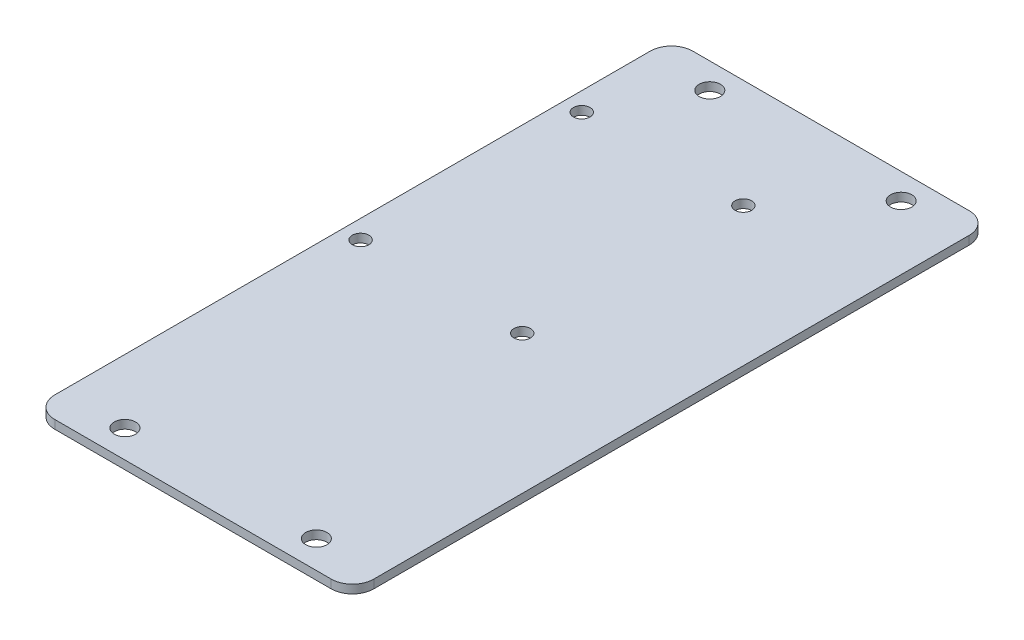
ISO-10303-21;
HEADER;
FILE_DESCRIPTION(('STEP AP214'),'2;1');
FILE_NAME('part.step','',(''),(''),'','','');
FILE_SCHEMA(('AUTOMOTIVE_DESIGN { 1 0 10303 214 1 1 1 1 }'));
ENDSEC;
DATA;
#1=APPLICATION_CONTEXT('core data for automotive mechanical design processes');
#2=APPLICATION_PROTOCOL_DEFINITION('international standard','automotive_design',2000,#1);
#3=PRODUCT_CONTEXT('',#1,'mechanical');
#4=PRODUCT('Part','Part','',(#3));
#5=PRODUCT_RELATED_PRODUCT_CATEGORY('part','',(#4));
#6=PRODUCT_DEFINITION_FORMATION('','',#4);
#7=PRODUCT_DEFINITION_CONTEXT('part definition',#1,'design');
#8=PRODUCT_DEFINITION('design','',#6,#7);
#9=PRODUCT_DEFINITION_SHAPE('','',#8);
#10=(LENGTH_UNIT() NAMED_UNIT(*) SI_UNIT(.MILLI.,.METRE.));
#11=(NAMED_UNIT(*) PLANE_ANGLE_UNIT() SI_UNIT($,.RADIAN.));
#12=(NAMED_UNIT(*) SI_UNIT($,.STERADIAN.) SOLID_ANGLE_UNIT());
#13=UNCERTAINTY_MEASURE_WITH_UNIT(LENGTH_MEASURE(1.E-05),#10,'distance_accuracy_value','');
#14=(GEOMETRIC_REPRESENTATION_CONTEXT(3) GLOBAL_UNCERTAINTY_ASSIGNED_CONTEXT((#13)) GLOBAL_UNIT_ASSIGNED_CONTEXT((#10,
#11,#12)) REPRESENTATION_CONTEXT('',''));
#15=CARTESIAN_POINT('',(0.,0.,0.));
#16=DIRECTION('',(0.,0.,1.));
#17=DIRECTION('',(1.,0.,0.));
#18=AXIS2_PLACEMENT_3D('',#15,#16,#17);
#19=CARTESIAN_POINT('',(0.,2.54,0.));
#20=DIRECTION('',(0.,1.,0.));
#21=DIRECTION('',(0.,0.,1.));
#22=AXIS2_PLACEMENT_3D('',#19,#20,#21);
#23=PLANE('',#22);
#24=CARTESIAN_POINT('',(28.575,2.54,86.995));
#25=DIRECTION('',(0.,1.,0.));
#26=DIRECTION('',(0.,0.,1.));
#27=AXIS2_PLACEMENT_3D('',#24,#25,#26);
#28=CIRCLE('',#27,3.17499999999999);
#29=CARTESIAN_POINT('',(28.575,2.54,90.17));
#30=VERTEX_POINT('',#29);
#31=EDGE_CURVE('E273',#30,#30,#28,.T.);
#32=ORIENTED_EDGE('',*,*,#31,.F.);
#33=EDGE_LOOP('',(#32));
#34=FACE_BOUND('',#33,.T.);
#35=CARTESIAN_POINT('',(-28.575,2.54,-87.63));
#36=DIRECTION('',(0.,1.,0.));
#37=DIRECTION('',(0.,0.,1.));
#38=AXIS2_PLACEMENT_3D('',#35,#36,#37);
#39=CIRCLE('',#38,3.175);
#40=CARTESIAN_POINT('',(-28.575,2.54,-84.455));
#41=VERTEX_POINT('',#40);
#42=EDGE_CURVE('E289',#41,#41,#39,.T.);
#43=ORIENTED_EDGE('',*,*,#42,.F.);
#44=EDGE_LOOP('',(#43));
#45=FACE_BOUND('',#44,.T.);
#46=CARTESIAN_POINT('',(6.22299999999999,2.54,3.17499999999998));
#47=DIRECTION('',(0.,1.,0.));
#48=DIRECTION('',(0.,0.,1.));
#49=AXIS2_PLACEMENT_3D('',#46,#47,#48);
#50=CIRCLE('',#49,2.4765);
#51=CARTESIAN_POINT('',(6.22299999999999,2.54,5.65149999999998));
#52=VERTEX_POINT('',#51);
#53=EDGE_CURVE('E305',#52,#52,#50,.T.);
#54=ORIENTED_EDGE('',*,*,#53,.F.);
#55=EDGE_LOOP('',(#54));
#56=FACE_BOUND('',#55,.T.);
#57=CARTESIAN_POINT('',(-42.037,2.54,-62.865));
#58=DIRECTION('',(0.,1.,0.));
#59=DIRECTION('',(0.,0.,1.));
#60=AXIS2_PLACEMENT_3D('',#57,#58,#59);
#61=CIRCLE('',#60,2.47650000000001);
#62=CARTESIAN_POINT('',(-42.037,2.54,-60.3885));
#63=VERTEX_POINT('',#62);
#64=EDGE_CURVE('E193',#63,#63,#61,.T.);
#65=ORIENTED_EDGE('',*,*,#64,.F.);
#66=EDGE_LOOP('',(#65));
#67=FACE_BOUND('',#66,.T.);
#68=DIRECTION('',(0.,0.,1.));
#69=VECTOR('',#68,1.);
#70=CARTESIAN_POINT('',(-47.625,2.54,-95.2499999999999));
#71=LINE('',#70,#69);
#72=CARTESIAN_POINT('',(-47.625,2.54,-88.8999999999999));
#73=VERTEX_POINT('',#72);
#74=CARTESIAN_POINT('',(-47.625,2.54,88.9000000000001));
#75=VERTEX_POINT('',#74);
#76=EDGE_CURVE('E181',#73,#75,#71,.T.);
#77=ORIENTED_EDGE('',*,*,#76,.T.);
#78=CARTESIAN_POINT('',(-41.275,2.54,88.9000000000001));
#79=DIRECTION('',(0.,1.,0.));
#80=DIRECTION('',(0.,0.,1.));
#81=AXIS2_PLACEMENT_3D('',#78,#79,#80);
#82=CIRCLE('',#81,6.35);
#83=CARTESIAN_POINT('',(-41.275,2.54,95.2500000000001));
#84=VERTEX_POINT('',#83);
#85=EDGE_CURVE('E169',#75,#84,#82,.T.);
#86=ORIENTED_EDGE('',*,*,#85,.T.);
#87=DIRECTION('',(1.,0.,0.));
#88=VECTOR('',#87,1.);
#89=CARTESIAN_POINT('',(-47.625,2.54,95.2500000000001));
#90=LINE('',#89,#88);
#91=CARTESIAN_POINT('',(41.275,2.54,95.2500000000001));
#92=VERTEX_POINT('',#91);
#93=EDGE_CURVE('E127',#84,#92,#90,.T.);
#94=ORIENTED_EDGE('',*,*,#93,.T.);
#95=CARTESIAN_POINT('',(41.275,2.54,88.9000000000001));
#96=DIRECTION('',(0.,1.,0.));
#97=DIRECTION('',(0.,0.,1.));
#98=AXIS2_PLACEMENT_3D('',#95,#96,#97);
#99=CIRCLE('',#98,6.35);
#100=CARTESIAN_POINT('',(47.625,2.54,88.9000000000001));
#101=VERTEX_POINT('',#100);
#102=EDGE_CURVE('E166',#92,#101,#99,.T.);
#103=ORIENTED_EDGE('',*,*,#102,.T.);
#104=DIRECTION('',(0.,0.,-1.));
#105=VECTOR('',#104,1.);
#106=CARTESIAN_POINT('',(47.625,2.54,-95.2499999999999));
#107=LINE('',#106,#105);
#108=CARTESIAN_POINT('',(47.625,2.54,-88.8999999999999));
#109=VERTEX_POINT('',#108);
#110=EDGE_CURVE('E136',#101,#109,#107,.T.);
#111=ORIENTED_EDGE('',*,*,#110,.T.);
#112=CARTESIAN_POINT('',(41.275,2.54,-88.8999999999999));
#113=DIRECTION('',(0.,1.,0.));
#114=DIRECTION('',(0.,0.,1.));
#115=AXIS2_PLACEMENT_3D('',#112,#113,#114);
#116=CIRCLE('',#115,6.35);
#117=CARTESIAN_POINT('',(41.275,2.54,-95.2499999999999));
#118=VERTEX_POINT('',#117);
#119=EDGE_CURVE('E61',#109,#118,#116,.T.);
#120=ORIENTED_EDGE('',*,*,#119,.T.);
#121=DIRECTION('',(-1.,0.,0.));
#122=VECTOR('',#121,1.);
#123=CARTESIAN_POINT('',(-47.625,2.54,-95.2499999999999));
#124=LINE('',#123,#122);
#125=CARTESIAN_POINT('',(-41.275,2.54,-95.2499999999999));
#126=VERTEX_POINT('',#125);
#127=EDGE_CURVE('E141',#118,#126,#124,.T.);
#128=ORIENTED_EDGE('',*,*,#127,.T.);
#129=CARTESIAN_POINT('',(-41.275,2.54,-88.8999999999999));
#130=DIRECTION('',(0.,1.,0.));
#131=DIRECTION('',(0.,0.,1.));
#132=AXIS2_PLACEMENT_3D('',#129,#130,#131);
#133=CIRCLE('',#132,6.35);
#134=EDGE_CURVE('E161',#126,#73,#133,.T.);
#135=ORIENTED_EDGE('',*,*,#134,.T.);
#136=EDGE_LOOP('',(#77,#86,#94,#103,#111,#120,#128,#135));
#137=FACE_BOUND('',#136,.T.);
#138=CARTESIAN_POINT('',(6.22299999999998,2.54,-62.865));
#139=DIRECTION('',(0.,1.,0.));
#140=DIRECTION('',(0.,0.,1.));
#141=AXIS2_PLACEMENT_3D('',#138,#139,#140);
#142=CIRCLE('',#141,2.4765);
#143=CARTESIAN_POINT('',(6.22299999999998,2.54,-60.3885));
#144=VERTEX_POINT('',#143);
#145=EDGE_CURVE('E313',#144,#144,#142,.T.);
#146=ORIENTED_EDGE('',*,*,#145,.F.);
#147=EDGE_LOOP('',(#146));
#148=FACE_BOUND('',#147,.T.);
#149=CARTESIAN_POINT('',(-42.037,2.54,3.17499999999998));
#150=DIRECTION('',(0.,1.,0.));
#151=DIRECTION('',(0.,0.,1.));
#152=AXIS2_PLACEMENT_3D('',#149,#150,#151);
#153=CIRCLE('',#152,2.4765);
#154=CARTESIAN_POINT('',(-42.037,2.54,5.65149999999999));
#155=VERTEX_POINT('',#154);
#156=EDGE_CURVE('E297',#155,#155,#153,.T.);
#157=ORIENTED_EDGE('',*,*,#156,.F.);
#158=EDGE_LOOP('',(#157));
#159=FACE_BOUND('',#158,.T.);
#160=CARTESIAN_POINT('',(28.575,2.54,-87.63));
#161=DIRECTION('',(0.,1.,0.));
#162=DIRECTION('',(0.,0.,1.));
#163=AXIS2_PLACEMENT_3D('',#160,#161,#162);
#164=CIRCLE('',#163,3.17499999999999);
#165=CARTESIAN_POINT('',(28.575,2.54,-84.455));
#166=VERTEX_POINT('',#165);
#167=EDGE_CURVE('E281',#166,#166,#164,.T.);
#168=ORIENTED_EDGE('',*,*,#167,.F.);
#169=EDGE_LOOP('',(#168));
#170=FACE_BOUND('',#169,.T.);
#171=CARTESIAN_POINT('',(-28.575,2.54,86.995));
#172=DIRECTION('',(0.,1.,0.));
#173=DIRECTION('',(0.,0.,1.));
#174=AXIS2_PLACEMENT_3D('',#171,#172,#173);
#175=CIRCLE('',#174,3.175);
#176=CARTESIAN_POINT('',(-28.575,2.54,90.17));
#177=VERTEX_POINT('',#176);
#178=EDGE_CURVE('E262',#177,#177,#175,.T.);
#179=ORIENTED_EDGE('',*,*,#178,.F.);
#180=EDGE_LOOP('',(#179));
#181=FACE_BOUND('',#180,.T.);
#182=ADVANCED_FACE('F39',(#34,#45,#56,#67,#137,#148,#159,#170,#181),#23,.T.);
#183=CARTESIAN_POINT('',(0.,0.,0.));
#184=DIRECTION('',(0.,1.,0.));
#185=DIRECTION('',(0.,0.,1.));
#186=AXIS2_PLACEMENT_3D('',#183,#184,#185);
#187=PLANE('',#186);
#188=DIRECTION('',(1.,0.,0.));
#189=VECTOR('',#188,1.);
#190=CARTESIAN_POINT('',(-47.625,0.,95.2500000000001));
#191=LINE('',#190,#189);
#192=CARTESIAN_POINT('',(-41.275,0.,95.2500000000001));
#193=VERTEX_POINT('',#192);
#194=CARTESIAN_POINT('',(41.275,0.,95.2500000000001));
#195=VERTEX_POINT('',#194);
#196=EDGE_CURVE('E124',#193,#195,#191,.T.);
#197=ORIENTED_EDGE('',*,*,#196,.F.);
#198=CARTESIAN_POINT('',(-41.275,0.,88.9000000000001));
#199=DIRECTION('',(0.,1.,0.));
#200=DIRECTION('',(0.,0.,1.));
#201=AXIS2_PLACEMENT_3D('',#198,#199,#200);
#202=CIRCLE('',#201,6.35);
#203=CARTESIAN_POINT('',(-47.625,0.,88.9000000000001));
#204=VERTEX_POINT('',#203);
#205=EDGE_CURVE('E106',#193,#204,#202,.F.);
#206=ORIENTED_EDGE('',*,*,#205,.T.);
#207=DIRECTION('',(0.,0.,1.));
#208=VECTOR('',#207,1.);
#209=CARTESIAN_POINT('',(-47.625,0.,-95.2499999999999));
#210=LINE('',#209,#208);
#211=CARTESIAN_POINT('',(-47.625,0.,-88.8999999999999));
#212=VERTEX_POINT('',#211);
#213=EDGE_CURVE('E137',#212,#204,#210,.T.);
#214=ORIENTED_EDGE('',*,*,#213,.F.);
#215=CARTESIAN_POINT('',(-41.275,0.,-88.8999999999999));
#216=DIRECTION('',(0.,1.,0.));
#217=DIRECTION('',(0.,0.,1.));
#218=AXIS2_PLACEMENT_3D('',#215,#216,#217);
#219=CIRCLE('',#218,6.35);
#220=CARTESIAN_POINT('',(-41.275,0.,-95.2499999999999));
#221=VERTEX_POINT('',#220);
#222=EDGE_CURVE('E129',#212,#221,#219,.F.);
#223=ORIENTED_EDGE('',*,*,#222,.T.);
#224=DIRECTION('',(-1.,0.,0.));
#225=VECTOR('',#224,1.);
#226=CARTESIAN_POINT('',(-47.625,0.,-95.2499999999999));
#227=LINE('',#226,#225);
#228=CARTESIAN_POINT('',(41.275,0.,-95.2499999999999));
#229=VERTEX_POINT('',#228);
#230=EDGE_CURVE('E143',#229,#221,#227,.T.);
#231=ORIENTED_EDGE('',*,*,#230,.F.);
#232=CARTESIAN_POINT('',(41.275,0.,-88.8999999999999));
#233=DIRECTION('',(0.,1.,0.));
#234=DIRECTION('',(0.,0.,1.));
#235=AXIS2_PLACEMENT_3D('',#232,#233,#234);
#236=CIRCLE('',#235,6.35);
#237=CARTESIAN_POINT('',(47.625,0.,-88.8999999999999));
#238=VERTEX_POINT('',#237);
#239=EDGE_CURVE('E151',#229,#238,#236,.F.);
#240=ORIENTED_EDGE('',*,*,#239,.T.);
#241=DIRECTION('',(0.,0.,-1.));
#242=VECTOR('',#241,1.);
#243=CARTESIAN_POINT('',(47.625,0.,-95.2499999999999));
#244=LINE('',#243,#242);
#245=CARTESIAN_POINT('',(47.625,0.,88.9000000000001));
#246=VERTEX_POINT('',#245);
#247=EDGE_CURVE('E190',#246,#238,#244,.T.);
#248=ORIENTED_EDGE('',*,*,#247,.F.);
#249=CARTESIAN_POINT('',(41.275,0.,88.9000000000001));
#250=DIRECTION('',(0.,1.,0.));
#251=DIRECTION('',(0.,0.,1.));
#252=AXIS2_PLACEMENT_3D('',#249,#250,#251);
#253=CIRCLE('',#252,6.35);
#254=EDGE_CURVE('E118',#246,#195,#253,.F.);
#255=ORIENTED_EDGE('',*,*,#254,.T.);
#256=EDGE_LOOP('',(#197,#206,#214,#223,#231,#240,#248,#255));
#257=FACE_BOUND('',#256,.T.);
#258=CARTESIAN_POINT('',(-42.037,0.,-62.865));
#259=DIRECTION('',(0.,1.,0.));
#260=DIRECTION('',(0.,0.,1.));
#261=AXIS2_PLACEMENT_3D('',#258,#259,#260);
#262=CIRCLE('',#261,2.47650000000001);
#263=CARTESIAN_POINT('',(-42.037,0.,-60.3885));
#264=VERTEX_POINT('',#263);
#265=EDGE_CURVE('E317',#264,#264,#262,.T.);
#266=ORIENTED_EDGE('',*,*,#265,.T.);
#267=EDGE_LOOP('',(#266));
#268=FACE_BOUND('',#267,.T.);
#269=CARTESIAN_POINT('',(6.22299999999998,0.,-62.865));
#270=DIRECTION('',(0.,1.,0.));
#271=DIRECTION('',(0.,0.,1.));
#272=AXIS2_PLACEMENT_3D('',#269,#270,#271);
#273=CIRCLE('',#272,2.4765);
#274=CARTESIAN_POINT('',(6.22299999999998,0.,-60.3885));
#275=VERTEX_POINT('',#274);
#276=EDGE_CURVE('E309',#275,#275,#273,.T.);
#277=ORIENTED_EDGE('',*,*,#276,.T.);
#278=EDGE_LOOP('',(#277));
#279=FACE_BOUND('',#278,.T.);
#280=CARTESIAN_POINT('',(6.22299999999999,0.,3.17499999999998));
#281=DIRECTION('',(0.,1.,0.));
#282=DIRECTION('',(0.,0.,1.));
#283=AXIS2_PLACEMENT_3D('',#280,#281,#282);
#284=CIRCLE('',#283,2.4765);
#285=CARTESIAN_POINT('',(6.22299999999999,0.,5.65149999999998));
#286=VERTEX_POINT('',#285);
#287=EDGE_CURVE('E301',#286,#286,#284,.T.);
#288=ORIENTED_EDGE('',*,*,#287,.T.);
#289=EDGE_LOOP('',(#288));
#290=FACE_BOUND('',#289,.T.);
#291=CARTESIAN_POINT('',(-42.037,0.,3.17499999999998));
#292=DIRECTION('',(0.,1.,0.));
#293=DIRECTION('',(0.,0.,1.));
#294=AXIS2_PLACEMENT_3D('',#291,#292,#293);
#295=CIRCLE('',#294,2.4765);
#296=CARTESIAN_POINT('',(-42.037,0.,5.65149999999999));
#297=VERTEX_POINT('',#296);
#298=EDGE_CURVE('E293',#297,#297,#295,.T.);
#299=ORIENTED_EDGE('',*,*,#298,.T.);
#300=EDGE_LOOP('',(#299));
#301=FACE_BOUND('',#300,.T.);
#302=CARTESIAN_POINT('',(-28.575,0.,-87.63));
#303=DIRECTION('',(0.,1.,0.));
#304=DIRECTION('',(0.,0.,1.));
#305=AXIS2_PLACEMENT_3D('',#302,#303,#304);
#306=CIRCLE('',#305,3.175);
#307=CARTESIAN_POINT('',(-28.575,0.,-84.455));
#308=VERTEX_POINT('',#307);
#309=EDGE_CURVE('E285',#308,#308,#306,.T.);
#310=ORIENTED_EDGE('',*,*,#309,.T.);
#311=EDGE_LOOP('',(#310));
#312=FACE_BOUND('',#311,.T.);
#313=CARTESIAN_POINT('',(28.575,0.,-87.63));
#314=DIRECTION('',(0.,1.,0.));
#315=DIRECTION('',(0.,0.,1.));
#316=AXIS2_PLACEMENT_3D('',#313,#314,#315);
#317=CIRCLE('',#316,3.17499999999999);
#318=CARTESIAN_POINT('',(28.575,0.,-84.455));
#319=VERTEX_POINT('',#318);
#320=EDGE_CURVE('E277',#319,#319,#317,.T.);
#321=ORIENTED_EDGE('',*,*,#320,.T.);
#322=EDGE_LOOP('',(#321));
#323=FACE_BOUND('',#322,.T.);
#324=CARTESIAN_POINT('',(28.575,0.,86.995));
#325=DIRECTION('',(0.,1.,0.));
#326=DIRECTION('',(0.,0.,1.));
#327=AXIS2_PLACEMENT_3D('',#324,#325,#326);
#328=CIRCLE('',#327,3.17499999999999);
#329=CARTESIAN_POINT('',(28.575,0.,90.17));
#330=VERTEX_POINT('',#329);
#331=EDGE_CURVE('E270',#330,#330,#328,.T.);
#332=ORIENTED_EDGE('',*,*,#331,.T.);
#333=EDGE_LOOP('',(#332));
#334=FACE_BOUND('',#333,.T.);
#335=CARTESIAN_POINT('',(-28.575,0.,86.995));
#336=DIRECTION('',(0.,1.,0.));
#337=DIRECTION('',(0.,0.,1.));
#338=AXIS2_PLACEMENT_3D('',#335,#336,#337);
#339=CIRCLE('',#338,3.175);
#340=CARTESIAN_POINT('',(-28.575,0.,90.17));
#341=VERTEX_POINT('',#340);
#342=EDGE_CURVE('E265',#341,#341,#339,.T.);
#343=ORIENTED_EDGE('',*,*,#342,.T.);
#344=EDGE_LOOP('',(#343));
#345=FACE_BOUND('',#344,.T.);
#346=ADVANCED_FACE('F132',(#257,#268,#279,#290,#301,#312,#323,#334,#345),#187,.F.);
#347=CARTESIAN_POINT('',(47.625,2.54,-95.2499999999999));
#348=DIRECTION('',(-1.,0.,0.));
#349=DIRECTION('',(0.,0.,1.));
#350=AXIS2_PLACEMENT_3D('',#347,#348,#349);
#351=PLANE('',#350);
#352=ORIENTED_EDGE('',*,*,#110,.F.);
#353=DIRECTION('',(0.,-1.,0.));
#354=VECTOR('',#353,1.);
#355=CARTESIAN_POINT('',(47.625,2.54,88.9000000000001));
#356=LINE('',#355,#354);
#357=EDGE_CURVE('E175',#101,#246,#356,.T.);
#358=ORIENTED_EDGE('',*,*,#357,.T.);
#359=ORIENTED_EDGE('',*,*,#247,.T.);
#360=DIRECTION('',(0.,-1.,0.));
#361=VECTOR('',#360,1.);
#362=CARTESIAN_POINT('',(47.625,2.54,-88.8999999999999));
#363=LINE('',#362,#361);
#364=EDGE_CURVE('E172',#238,#109,#363,.F.);
#365=ORIENTED_EDGE('',*,*,#364,.T.);
#366=EDGE_LOOP('',(#352,#358,#359,#365));
#367=FACE_BOUND('',#366,.T.);
#368=ADVANCED_FACE('F212',(#367),#351,.F.);
#369=CARTESIAN_POINT('',(-47.625,2.54,-95.2499999999999));
#370=DIRECTION('',(0.,0.,1.));
#371=DIRECTION('',(1.,0.,0.));
#372=AXIS2_PLACEMENT_3D('',#369,#370,#371);
#373=PLANE('',#372);
#374=ORIENTED_EDGE('',*,*,#127,.F.);
#375=DIRECTION('',(0.,-1.,0.));
#376=VECTOR('',#375,1.);
#377=CARTESIAN_POINT('',(41.275,2.54,-95.2499999999999));
#378=LINE('',#377,#376);
#379=EDGE_CURVE('E11',#118,#229,#378,.T.);
#380=ORIENTED_EDGE('',*,*,#379,.T.);
#381=ORIENTED_EDGE('',*,*,#230,.T.);
#382=DIRECTION('',(0.,-1.,0.));
#383=VECTOR('',#382,1.);
#384=CARTESIAN_POINT('',(-41.275,2.54,-95.2499999999999));
#385=LINE('',#384,#383);
#386=EDGE_CURVE('E48',#221,#126,#385,.F.);
#387=ORIENTED_EDGE('',*,*,#386,.T.);
#388=EDGE_LOOP('',(#374,#380,#381,#387));
#389=FACE_BOUND('',#388,.T.);
#390=ADVANCED_FACE('F196',(#389),#373,.F.);
#391=CARTESIAN_POINT('',(-47.625,2.54,-95.2499999999999));
#392=DIRECTION('',(1.,0.,0.));
#393=DIRECTION('',(0.,0.,-1.));
#394=AXIS2_PLACEMENT_3D('',#391,#392,#393);
#395=PLANE('',#394);
#396=ORIENTED_EDGE('',*,*,#213,.T.);
#397=DIRECTION('',(0.,-1.,0.));
#398=VECTOR('',#397,1.);
#399=CARTESIAN_POINT('',(-47.625,2.54,88.9000000000001));
#400=LINE('',#399,#398);
#401=EDGE_CURVE('E111',#204,#75,#400,.F.);
#402=ORIENTED_EDGE('',*,*,#401,.T.);
#403=ORIENTED_EDGE('',*,*,#76,.F.);
#404=DIRECTION('',(0.,-1.,0.));
#405=VECTOR('',#404,1.);
#406=CARTESIAN_POINT('',(-47.625,2.54,-88.8999999999999));
#407=LINE('',#406,#405);
#408=EDGE_CURVE('E117',#73,#212,#407,.T.);
#409=ORIENTED_EDGE('',*,*,#408,.T.);
#410=EDGE_LOOP('',(#396,#402,#403,#409));
#411=FACE_BOUND('',#410,.T.);
#412=ADVANCED_FACE('F203',(#411),#395,.F.);
#413=CARTESIAN_POINT('',(-47.625,2.54,95.2500000000001));
#414=DIRECTION('',(0.,0.,-1.));
#415=DIRECTION('',(-1.,0.,0.));
#416=AXIS2_PLACEMENT_3D('',#413,#414,#415);
#417=PLANE('',#416);
#418=ORIENTED_EDGE('',*,*,#93,.F.);
#419=DIRECTION('',(0.,-1.,0.));
#420=VECTOR('',#419,1.);
#421=CARTESIAN_POINT('',(-41.275,2.54,95.2500000000001));
#422=LINE('',#421,#420);
#423=EDGE_CURVE('E110',#84,#193,#422,.T.);
#424=ORIENTED_EDGE('',*,*,#423,.T.);
#425=ORIENTED_EDGE('',*,*,#196,.T.);
#426=DIRECTION('',(0.,-1.,0.));
#427=VECTOR('',#426,1.);
#428=CARTESIAN_POINT('',(41.275,2.54,95.2500000000001));
#429=LINE('',#428,#427);
#430=EDGE_CURVE('E130',#195,#92,#429,.F.);
#431=ORIENTED_EDGE('',*,*,#430,.T.);
#432=EDGE_LOOP('',(#418,#424,#425,#431));
#433=FACE_BOUND('',#432,.T.);
#434=ADVANCED_FACE('F123',(#433),#417,.F.);
#435=CARTESIAN_POINT('',(-42.037,2.54,-62.865));
#436=DIRECTION('',(0.,-1.,0.));
#437=DIRECTION('',(0.,0.,-1.));
#438=AXIS2_PLACEMENT_3D('',#435,#436,#437);
#439=CYLINDRICAL_SURFACE('',#438,2.47650000000001);
#440=ORIENTED_EDGE('',*,*,#64,.T.);
#441=EDGE_LOOP('',(#440));
#442=FACE_BOUND('',#441,.T.);
#443=ORIENTED_EDGE('',*,*,#265,.F.);
#444=EDGE_LOOP('',(#443));
#445=FACE_BOUND('',#444,.T.);
#446=ADVANCED_FACE('F210',(#442,#445),#439,.F.);
#447=CARTESIAN_POINT('',(6.22299999999998,2.54,-62.865));
#448=DIRECTION('',(0.,-1.,0.));
#449=DIRECTION('',(0.,0.,-1.));
#450=AXIS2_PLACEMENT_3D('',#447,#448,#449);
#451=CYLINDRICAL_SURFACE('',#450,2.4765);
#452=ORIENTED_EDGE('',*,*,#145,.T.);
#453=EDGE_LOOP('',(#452));
#454=FACE_BOUND('',#453,.T.);
#455=ORIENTED_EDGE('',*,*,#276,.F.);
#456=EDGE_LOOP('',(#455));
#457=FACE_BOUND('',#456,.T.);
#458=ADVANCED_FACE('F226',(#454,#457),#451,.F.);
#459=CARTESIAN_POINT('',(6.22299999999999,2.54,3.17499999999998));
#460=DIRECTION('',(0.,-1.,0.));
#461=DIRECTION('',(0.,0.,-1.));
#462=AXIS2_PLACEMENT_3D('',#459,#460,#461);
#463=CYLINDRICAL_SURFACE('',#462,2.4765);
#464=ORIENTED_EDGE('',*,*,#53,.T.);
#465=EDGE_LOOP('',(#464));
#466=FACE_BOUND('',#465,.T.);
#467=ORIENTED_EDGE('',*,*,#287,.F.);
#468=EDGE_LOOP('',(#467));
#469=FACE_BOUND('',#468,.T.);
#470=ADVANCED_FACE('F230',(#466,#469),#463,.F.);
#471=CARTESIAN_POINT('',(-42.037,2.54,3.17499999999998));
#472=DIRECTION('',(0.,-1.,0.));
#473=DIRECTION('',(0.,0.,-1.));
#474=AXIS2_PLACEMENT_3D('',#471,#472,#473);
#475=CYLINDRICAL_SURFACE('',#474,2.4765);
#476=ORIENTED_EDGE('',*,*,#156,.T.);
#477=EDGE_LOOP('',(#476));
#478=FACE_BOUND('',#477,.T.);
#479=ORIENTED_EDGE('',*,*,#298,.F.);
#480=EDGE_LOOP('',(#479));
#481=FACE_BOUND('',#480,.T.);
#482=ADVANCED_FACE('F234',(#478,#481),#475,.F.);
#483=CARTESIAN_POINT('',(-28.575,2.54,-87.63));
#484=DIRECTION('',(0.,-1.,0.));
#485=DIRECTION('',(0.,0.,-1.));
#486=AXIS2_PLACEMENT_3D('',#483,#484,#485);
#487=CYLINDRICAL_SURFACE('',#486,3.175);
#488=ORIENTED_EDGE('',*,*,#42,.T.);
#489=EDGE_LOOP('',(#488));
#490=FACE_BOUND('',#489,.T.);
#491=ORIENTED_EDGE('',*,*,#309,.F.);
#492=EDGE_LOOP('',(#491));
#493=FACE_BOUND('',#492,.T.);
#494=ADVANCED_FACE('F238',(#490,#493),#487,.F.);
#495=CARTESIAN_POINT('',(28.575,2.54,-87.63));
#496=DIRECTION('',(0.,-1.,0.));
#497=DIRECTION('',(0.,0.,-1.));
#498=AXIS2_PLACEMENT_3D('',#495,#496,#497);
#499=CYLINDRICAL_SURFACE('',#498,3.17499999999999);
#500=ORIENTED_EDGE('',*,*,#167,.T.);
#501=EDGE_LOOP('',(#500));
#502=FACE_BOUND('',#501,.T.);
#503=ORIENTED_EDGE('',*,*,#320,.F.);
#504=EDGE_LOOP('',(#503));
#505=FACE_BOUND('',#504,.T.);
#506=ADVANCED_FACE('F242',(#502,#505),#499,.F.);
#507=CARTESIAN_POINT('',(28.575,2.54,86.995));
#508=DIRECTION('',(0.,-1.,0.));
#509=DIRECTION('',(0.,0.,-1.));
#510=AXIS2_PLACEMENT_3D('',#507,#508,#509);
#511=CYLINDRICAL_SURFACE('',#510,3.17499999999999);
#512=ORIENTED_EDGE('',*,*,#31,.T.);
#513=EDGE_LOOP('',(#512));
#514=FACE_BOUND('',#513,.T.);
#515=ORIENTED_EDGE('',*,*,#331,.F.);
#516=EDGE_LOOP('',(#515));
#517=FACE_BOUND('',#516,.T.);
#518=ADVANCED_FACE('F246',(#514,#517),#511,.F.);
#519=CARTESIAN_POINT('',(-28.575,2.54,86.995));
#520=DIRECTION('',(0.,-1.,0.));
#521=DIRECTION('',(0.,0.,-1.));
#522=AXIS2_PLACEMENT_3D('',#519,#520,#521);
#523=CYLINDRICAL_SURFACE('',#522,3.175);
#524=ORIENTED_EDGE('',*,*,#178,.T.);
#525=EDGE_LOOP('',(#524));
#526=FACE_BOUND('',#525,.T.);
#527=ORIENTED_EDGE('',*,*,#342,.F.);
#528=EDGE_LOOP('',(#527));
#529=FACE_BOUND('',#528,.T.);
#530=ADVANCED_FACE('F250',(#526,#529),#523,.F.);
#531=CARTESIAN_POINT('',(-41.275,2.54,88.9000000000001));
#532=DIRECTION('',(0.,-1.,0.));
#533=DIRECTION('',(0.,0.,-1.));
#534=AXIS2_PLACEMENT_3D('',#531,#532,#533);
#535=CYLINDRICAL_SURFACE('',#534,6.35);
#536=ORIENTED_EDGE('',*,*,#85,.F.);
#537=ORIENTED_EDGE('',*,*,#401,.F.);
#538=ORIENTED_EDGE('',*,*,#205,.F.);
#539=ORIENTED_EDGE('',*,*,#423,.F.);
#540=EDGE_LOOP('',(#536,#537,#538,#539));
#541=FACE_BOUND('',#540,.T.);
#542=ADVANCED_FACE('F109',(#541),#535,.T.);
#543=CARTESIAN_POINT('',(41.275,2.54,88.9000000000001));
#544=DIRECTION('',(0.,-1.,0.));
#545=DIRECTION('',(0.,0.,-1.));
#546=AXIS2_PLACEMENT_3D('',#543,#544,#545);
#547=CYLINDRICAL_SURFACE('',#546,6.35);
#548=ORIENTED_EDGE('',*,*,#102,.F.);
#549=ORIENTED_EDGE('',*,*,#430,.F.);
#550=ORIENTED_EDGE('',*,*,#254,.F.);
#551=ORIENTED_EDGE('',*,*,#357,.F.);
#552=EDGE_LOOP('',(#548,#549,#550,#551));
#553=FACE_BOUND('',#552,.T.);
#554=ADVANCED_FACE('F257',(#553),#547,.T.);
#555=CARTESIAN_POINT('',(41.275,2.54,-88.8999999999999));
#556=DIRECTION('',(0.,-1.,0.));
#557=DIRECTION('',(0.,0.,-1.));
#558=AXIS2_PLACEMENT_3D('',#555,#556,#557);
#559=CYLINDRICAL_SURFACE('',#558,6.35);
#560=ORIENTED_EDGE('',*,*,#119,.F.);
#561=ORIENTED_EDGE('',*,*,#364,.F.);
#562=ORIENTED_EDGE('',*,*,#239,.F.);
#563=ORIENTED_EDGE('',*,*,#379,.F.);
#564=EDGE_LOOP('',(#560,#561,#562,#563));
#565=FACE_BOUND('',#564,.T.);
#566=ADVANCED_FACE('F359',(#565),#559,.T.);
#567=CARTESIAN_POINT('',(-41.275,2.54,-88.8999999999999));
#568=DIRECTION('',(0.,-1.,0.));
#569=DIRECTION('',(0.,0.,-1.));
#570=AXIS2_PLACEMENT_3D('',#567,#568,#569);
#571=CYLINDRICAL_SURFACE('',#570,6.35);
#572=ORIENTED_EDGE('',*,*,#134,.F.);
#573=ORIENTED_EDGE('',*,*,#386,.F.);
#574=ORIENTED_EDGE('',*,*,#222,.F.);
#575=ORIENTED_EDGE('',*,*,#408,.F.);
#576=EDGE_LOOP('',(#572,#573,#574,#575));
#577=FACE_BOUND('',#576,.T.);
#578=ADVANCED_FACE('F41',(#577),#571,.T.);
#579=CLOSED_SHELL('',(#182,#346,#368,#390,#412,#434,#446,#458,#470,#482,#494,#506,#518,#530,
#542,#554,#566,#578));
#580=MANIFOLD_SOLID_BREP('B2',#579);
#581=ADVANCED_BREP_SHAPE_REPRESENTATION('',(#18,#580),#14);
#582=SHAPE_DEFINITION_REPRESENTATION(#9,#581);
ENDSEC;
END-ISO-10303-21;
